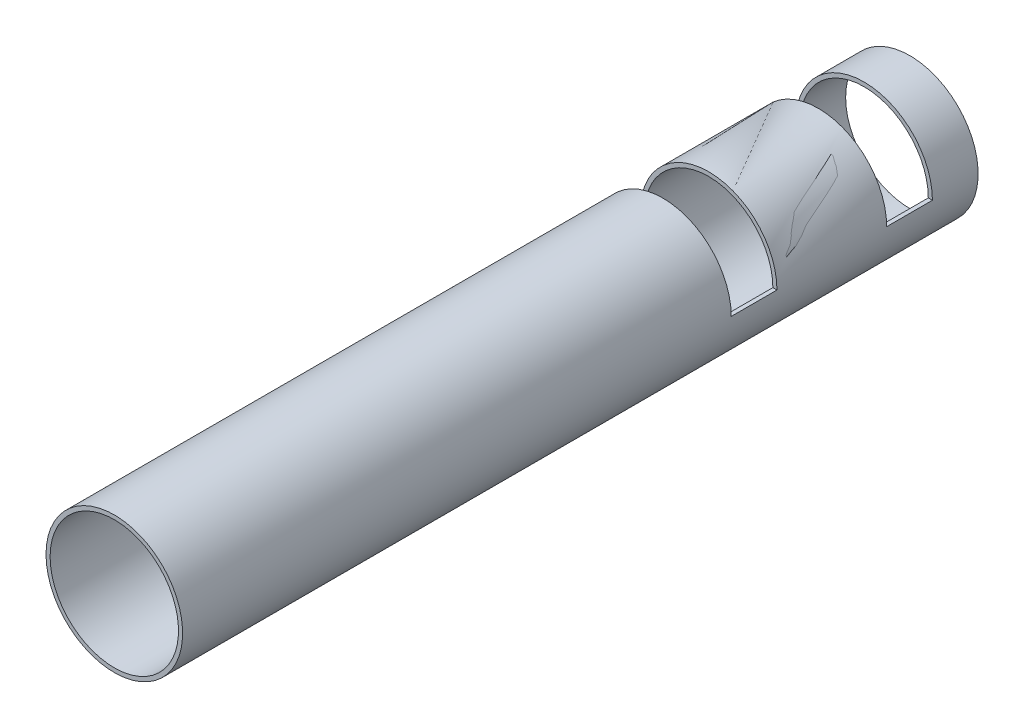
ISO-10303-21;
HEADER;
FILE_DESCRIPTION(('STEP AP214'),'2;1');
FILE_NAME('part.step','',(''),(''),'','','');
FILE_SCHEMA(('AUTOMOTIVE_DESIGN { 1 0 10303 214 1 1 1 1 }'));
ENDSEC;
DATA;
#1=APPLICATION_CONTEXT('core data for automotive mechanical design processes');
#2=APPLICATION_PROTOCOL_DEFINITION('international standard','automotive_design',2000,#1);
#3=PRODUCT_CONTEXT('',#1,'mechanical');
#4=PRODUCT('Part','Part','',(#3));
#5=PRODUCT_RELATED_PRODUCT_CATEGORY('part','',(#4));
#6=PRODUCT_DEFINITION_FORMATION('','',#4);
#7=PRODUCT_DEFINITION_CONTEXT('part definition',#1,'design');
#8=PRODUCT_DEFINITION('design','',#6,#7);
#9=PRODUCT_DEFINITION_SHAPE('','',#8);
#10=(LENGTH_UNIT() NAMED_UNIT(*) SI_UNIT(.MILLI.,.METRE.));
#11=(NAMED_UNIT(*) PLANE_ANGLE_UNIT() SI_UNIT($,.RADIAN.));
#12=(NAMED_UNIT(*) SI_UNIT($,.STERADIAN.) SOLID_ANGLE_UNIT());
#13=UNCERTAINTY_MEASURE_WITH_UNIT(LENGTH_MEASURE(1.E-05),#10,'distance_accuracy_value','');
#14=(GEOMETRIC_REPRESENTATION_CONTEXT(3) GLOBAL_UNCERTAINTY_ASSIGNED_CONTEXT((#13)) GLOBAL_UNIT_ASSIGNED_CONTEXT((#10,
#11,#12)) REPRESENTATION_CONTEXT('',''));
#15=CARTESIAN_POINT('',(0.,0.,0.));
#16=DIRECTION('',(0.,0.,1.));
#17=DIRECTION('',(1.,0.,0.));
#18=AXIS2_PLACEMENT_3D('',#15,#16,#17);
#19=CARTESIAN_POINT('',(0.,0.,27.));
#20=DIRECTION('',(0.,0.,1.));
#21=DIRECTION('',(1.,0.,0.));
#22=AXIS2_PLACEMENT_3D('',#19,#20,#21);
#23=PLANE('',#22);
#24=DIRECTION('',(1.,0.,0.));
#25=VECTOR('',#24,1.);
#26=CARTESIAN_POINT('',(0.,0.,27.));
#27=LINE('',#26,#25);
#28=CARTESIAN_POINT('',(-7.47,0.,27.));
#29=VERTEX_POINT('',#28);
#30=CARTESIAN_POINT('',(-7.02,0.,27.));
#31=VERTEX_POINT('',#30);
#32=EDGE_CURVE('E77',#29,#31,#27,.T.);
#33=ORIENTED_EDGE('',*,*,#32,.F.);
#34=CARTESIAN_POINT('',(0.,0.,27.));
#35=DIRECTION('',(0.,0.,-1.));
#36=DIRECTION('',(-1.,0.,0.));
#37=AXIS2_PLACEMENT_3D('',#34,#35,#36);
#38=CIRCLE('',#37,7.47);
#39=CARTESIAN_POINT('',(7.47,0.,27.));
#40=VERTEX_POINT('',#39);
#41=EDGE_CURVE('E100',#40,#29,#38,.F.);
#42=ORIENTED_EDGE('',*,*,#41,.F.);
#43=DIRECTION('',(1.,0.,0.));
#44=VECTOR('',#43,1.);
#45=CARTESIAN_POINT('',(0.,0.,27.));
#46=LINE('',#45,#44);
#47=CARTESIAN_POINT('',(7.02,0.,27.));
#48=VERTEX_POINT('',#47);
#49=EDGE_CURVE('E94',#48,#40,#46,.T.);
#50=ORIENTED_EDGE('',*,*,#49,.F.);
#51=CARTESIAN_POINT('',(0.,0.,27.));
#52=DIRECTION('',(0.,0.,-1.));
#53=DIRECTION('',(-1.,0.,0.));
#54=AXIS2_PLACEMENT_3D('',#51,#52,#53);
#55=CIRCLE('',#54,7.02);
#56=EDGE_CURVE('E20',#31,#48,#55,.T.);
#57=ORIENTED_EDGE('',*,*,#56,.F.);
#58=EDGE_LOOP('',(#33,#42,#50,#57));
#59=FACE_BOUND('',#58,.T.);
#60=ADVANCED_FACE('F17',(#59),#23,.F.);
#61=CARTESIAN_POINT('',(0.,0.,5.));
#62=DIRECTION('',(0.,0.,1.));
#63=DIRECTION('',(1.,0.,0.));
#64=AXIS2_PLACEMENT_3D('',#61,#62,#63);
#65=PLANE('',#64);
#66=DIRECTION('',(1.,0.,0.));
#67=VECTOR('',#66,1.);
#68=CARTESIAN_POINT('',(0.,0.,5.));
#69=LINE('',#68,#67);
#70=CARTESIAN_POINT('',(-7.47,0.,5.));
#71=VERTEX_POINT('',#70);
#72=CARTESIAN_POINT('',(-7.02,0.,5.));
#73=VERTEX_POINT('',#72);
#74=EDGE_CURVE('E142',#71,#73,#69,.T.);
#75=ORIENTED_EDGE('',*,*,#74,.T.);
#76=CARTESIAN_POINT('',(0.,0.,5.));
#77=DIRECTION('',(0.,0.,-1.));
#78=DIRECTION('',(-1.,0.,0.));
#79=AXIS2_PLACEMENT_3D('',#76,#77,#78);
#80=CIRCLE('',#79,7.02);
#81=CARTESIAN_POINT('',(7.02,0.,5.));
#82=VERTEX_POINT('',#81);
#83=EDGE_CURVE('E133',#73,#82,#80,.T.);
#84=ORIENTED_EDGE('',*,*,#83,.T.);
#85=DIRECTION('',(1.,0.,0.));
#86=VECTOR('',#85,1.);
#87=CARTESIAN_POINT('',(0.,0.,5.));
#88=LINE('',#87,#86);
#89=CARTESIAN_POINT('',(7.47,0.,5.));
#90=VERTEX_POINT('',#89);
#91=EDGE_CURVE('E90',#82,#90,#88,.T.);
#92=ORIENTED_EDGE('',*,*,#91,.T.);
#93=CARTESIAN_POINT('',(0.,0.,5.));
#94=DIRECTION('',(0.,0.,-1.));
#95=DIRECTION('',(-1.,0.,0.));
#96=AXIS2_PLACEMENT_3D('',#93,#94,#95);
#97=CIRCLE('',#96,7.47);
#98=EDGE_CURVE('E117',#71,#90,#97,.T.);
#99=ORIENTED_EDGE('',*,*,#98,.F.);
#100=EDGE_LOOP('',(#75,#84,#92,#99));
#101=FACE_BOUND('',#100,.T.);
#102=ADVANCED_FACE('F218',(#101),#65,.T.);
#103=CARTESIAN_POINT('',(0.,0.,22.));
#104=DIRECTION('',(0.,0.,1.));
#105=DIRECTION('',(1.,0.,0.));
#106=AXIS2_PLACEMENT_3D('',#103,#104,#105);
#107=PLANE('',#106);
#108=CARTESIAN_POINT('',(0.,0.,22.));
#109=DIRECTION('',(0.,0.,-1.));
#110=DIRECTION('',(-1.,0.,0.));
#111=AXIS2_PLACEMENT_3D('',#108,#109,#110);
#112=CIRCLE('',#111,7.47);
#113=CARTESIAN_POINT('',(-7.47,0.,22.));
#114=VERTEX_POINT('',#113);
#115=CARTESIAN_POINT('',(7.47,0.,22.));
#116=VERTEX_POINT('',#115);
#117=EDGE_CURVE('E114',#114,#116,#112,.T.);
#118=ORIENTED_EDGE('',*,*,#117,.F.);
#119=DIRECTION('',(1.,0.,0.));
#120=VECTOR('',#119,1.);
#121=CARTESIAN_POINT('',(0.,0.,22.));
#122=LINE('',#121,#120);
#123=CARTESIAN_POINT('',(-7.02,0.,22.));
#124=VERTEX_POINT('',#123);
#125=EDGE_CURVE('E126',#114,#124,#122,.T.);
#126=ORIENTED_EDGE('',*,*,#125,.T.);
#127=CARTESIAN_POINT('',(0.,0.,22.));
#128=DIRECTION('',(0.,0.,-1.));
#129=DIRECTION('',(-1.,0.,0.));
#130=AXIS2_PLACEMENT_3D('',#127,#128,#129);
#131=CIRCLE('',#130,7.02);
#132=CARTESIAN_POINT('',(7.02,0.,22.));
#133=VERTEX_POINT('',#132);
#134=EDGE_CURVE('E132',#124,#133,#131,.T.);
#135=ORIENTED_EDGE('',*,*,#134,.T.);
#136=DIRECTION('',(1.,0.,0.));
#137=VECTOR('',#136,1.);
#138=CARTESIAN_POINT('',(0.,0.,22.));
#139=LINE('',#138,#137);
#140=EDGE_CURVE('E35',#133,#116,#139,.T.);
#141=ORIENTED_EDGE('',*,*,#140,.T.);
#142=EDGE_LOOP('',(#118,#126,#135,#141));
#143=FACE_BOUND('',#142,.T.);
#144=ADVANCED_FACE('F214',(#143),#107,.T.);
#145=CARTESIAN_POINT('',(0.,0.,10.));
#146=DIRECTION('',(0.,0.,1.));
#147=DIRECTION('',(1.,0.,0.));
#148=AXIS2_PLACEMENT_3D('',#145,#146,#147);
#149=PLANE('',#148);
#150=DIRECTION('',(1.,0.,0.));
#151=VECTOR('',#150,1.);
#152=CARTESIAN_POINT('',(0.,0.,9.99999999999999));
#153=LINE('',#152,#151);
#154=CARTESIAN_POINT('',(-7.02,0.,9.99999999999999));
#155=VERTEX_POINT('',#154);
#156=CARTESIAN_POINT('',(-7.47,0.,9.99999999999999));
#157=VERTEX_POINT('',#156);
#158=EDGE_CURVE('E124',#155,#157,#153,.F.);
#159=ORIENTED_EDGE('',*,*,#158,.T.);
#160=CARTESIAN_POINT('',(0.,0.,9.99999999999999));
#161=DIRECTION('',(0.,0.,-1.));
#162=DIRECTION('',(-1.,0.,0.));
#163=AXIS2_PLACEMENT_3D('',#160,#161,#162);
#164=CIRCLE('',#163,7.47);
#165=CARTESIAN_POINT('',(7.47,0.,9.99999999999999));
#166=VERTEX_POINT('',#165);
#167=EDGE_CURVE('E97',#166,#157,#164,.F.);
#168=ORIENTED_EDGE('',*,*,#167,.F.);
#169=DIRECTION('',(1.,0.,0.));
#170=VECTOR('',#169,1.);
#171=CARTESIAN_POINT('',(0.,0.,9.99999999999999));
#172=LINE('',#171,#170);
#173=CARTESIAN_POINT('',(7.02,0.,9.99999999999999));
#174=VERTEX_POINT('',#173);
#175=EDGE_CURVE('E116',#166,#174,#172,.F.);
#176=ORIENTED_EDGE('',*,*,#175,.T.);
#177=CARTESIAN_POINT('',(0.,0.,9.99999999999999));
#178=DIRECTION('',(0.,0.,-1.));
#179=DIRECTION('',(-1.,0.,0.));
#180=AXIS2_PLACEMENT_3D('',#177,#178,#179);
#181=CIRCLE('',#180,7.02);
#182=EDGE_CURVE('E130',#155,#174,#181,.T.);
#183=ORIENTED_EDGE('',*,*,#182,.F.);
#184=EDGE_LOOP('',(#159,#168,#176,#183));
#185=FACE_BOUND('',#184,.T.);
#186=ADVANCED_FACE('F167',(#185),#149,.F.);
#187=CARTESIAN_POINT('',(0.,0.,87.));
#188=DIRECTION('',(0.,0.,-1.));
#189=DIRECTION('',(-1.,0.,0.));
#190=AXIS2_PLACEMENT_3D('',#187,#188,#189);
#191=CYLINDRICAL_SURFACE('',#190,7.02);
#192=DIRECTION('',(0.,0.,-1.));
#193=VECTOR('',#192,1.);
#194=CARTESIAN_POINT('',(-7.02,0.,87.));
#195=LINE('',#194,#193);
#196=EDGE_CURVE('E87',#124,#31,#195,.F.);
#197=ORIENTED_EDGE('',*,*,#196,.T.);
#198=ORIENTED_EDGE('',*,*,#56,.T.);
#199=DIRECTION('',(0.,0.,-1.));
#200=VECTOR('',#199,1.);
#201=CARTESIAN_POINT('',(7.02,0.,87.));
#202=LINE('',#201,#200);
#203=EDGE_CURVE('E86',#48,#133,#202,.T.);
#204=ORIENTED_EDGE('',*,*,#203,.T.);
#205=ORIENTED_EDGE('',*,*,#134,.F.);
#206=EDGE_LOOP('',(#197,#198,#204,#205));
#207=FACE_BOUND('',#206,.T.);
#208=DIRECTION('',(0.,0.,-1.));
#209=VECTOR('',#208,1.);
#210=CARTESIAN_POINT('',(-7.02,0.,87.));
#211=LINE('',#210,#209);
#212=EDGE_CURVE('E141',#73,#155,#211,.F.);
#213=ORIENTED_EDGE('',*,*,#212,.T.);
#214=ORIENTED_EDGE('',*,*,#182,.T.);
#215=DIRECTION('',(0.,0.,-1.));
#216=VECTOR('',#215,1.);
#217=CARTESIAN_POINT('',(7.02,0.,87.));
#218=LINE('',#217,#216);
#219=EDGE_CURVE('E120',#174,#82,#218,.T.);
#220=ORIENTED_EDGE('',*,*,#219,.T.);
#221=ORIENTED_EDGE('',*,*,#83,.F.);
#222=EDGE_LOOP('',(#213,#214,#220,#221));
#223=FACE_BOUND('',#222,.T.);
#224=CARTESIAN_POINT('',(0.,0.,0.));
#225=DIRECTION('',(0.,0.,-1.));
#226=DIRECTION('',(-1.,0.,0.));
#227=AXIS2_PLACEMENT_3D('',#224,#225,#226);
#228=CIRCLE('',#227,7.02);
#229=CARTESIAN_POINT('',(-7.02,0.,0.));
#230=VERTEX_POINT('',#229);
#231=EDGE_CURVE('E121',#230,#230,#228,.T.);
#232=ORIENTED_EDGE('',*,*,#231,.T.);
#233=EDGE_LOOP('',(#232));
#234=FACE_BOUND('',#233,.T.);
#235=CARTESIAN_POINT('',(0.,0.,87.));
#236=DIRECTION('',(0.,0.,-1.));
#237=DIRECTION('',(-1.,0.,0.));
#238=AXIS2_PLACEMENT_3D('',#235,#236,#237);
#239=CIRCLE('',#238,7.02);
#240=CARTESIAN_POINT('',(-7.02,0.,87.));
#241=VERTEX_POINT('',#240);
#242=EDGE_CURVE('E127',#241,#241,#239,.T.);
#243=ORIENTED_EDGE('',*,*,#242,.F.);
#244=EDGE_LOOP('',(#243));
#245=FACE_BOUND('',#244,.T.);
#246=ADVANCED_FACE('F84',(#207,#223,#234,#245),#191,.F.);
#247=CARTESIAN_POINT('',(0.,0.,87.));
#248=DIRECTION('',(0.,0.,1.));
#249=DIRECTION('',(1.,0.,0.));
#250=AXIS2_PLACEMENT_3D('',#247,#248,#249);
#251=PLANE('',#250);
#252=CARTESIAN_POINT('',(0.,0.,87.));
#253=DIRECTION('',(0.,0.,-1.));
#254=DIRECTION('',(-1.,0.,0.));
#255=AXIS2_PLACEMENT_3D('',#252,#253,#254);
#256=CIRCLE('',#255,7.47);
#257=CARTESIAN_POINT('',(-7.47,0.,87.));
#258=VERTEX_POINT('',#257);
#259=EDGE_CURVE('E96',#258,#258,#256,.T.);
#260=ORIENTED_EDGE('',*,*,#259,.F.);
#261=EDGE_LOOP('',(#260));
#262=FACE_BOUND('',#261,.T.);
#263=ORIENTED_EDGE('',*,*,#242,.T.);
#264=EDGE_LOOP('',(#263));
#265=FACE_BOUND('',#264,.T.);
#266=ADVANCED_FACE('F177',(#262,#265),#251,.T.);
#267=CARTESIAN_POINT('',(0.,0.,87.));
#268=DIRECTION('',(0.,-1.,0.));
#269=DIRECTION('',(0.,0.,-1.));
#270=AXIS2_PLACEMENT_3D('',#267,#268,#269);
#271=PLANE('',#270);
#272=ORIENTED_EDGE('',*,*,#196,.F.);
#273=ORIENTED_EDGE('',*,*,#125,.F.);
#274=DIRECTION('',(0.,0.,-1.));
#275=VECTOR('',#274,1.);
#276=CARTESIAN_POINT('',(-7.47,0.,87.));
#277=LINE('',#276,#275);
#278=EDGE_CURVE('E111',#29,#114,#277,.T.);
#279=ORIENTED_EDGE('',*,*,#278,.F.);
#280=ORIENTED_EDGE('',*,*,#32,.T.);
#281=EDGE_LOOP('',(#272,#273,#279,#280));
#282=FACE_BOUND('',#281,.T.);
#283=ADVANCED_FACE('F174',(#282),#271,.F.);
#284=CARTESIAN_POINT('',(0.,0.,87.));
#285=DIRECTION('',(0.,-1.,0.));
#286=DIRECTION('',(0.,0.,-1.));
#287=AXIS2_PLACEMENT_3D('',#284,#285,#286);
#288=PLANE('',#287);
#289=ORIENTED_EDGE('',*,*,#212,.F.);
#290=ORIENTED_EDGE('',*,*,#74,.F.);
#291=DIRECTION('',(0.,0.,-1.));
#292=VECTOR('',#291,1.);
#293=CARTESIAN_POINT('',(-7.47,0.,87.));
#294=LINE('',#293,#292);
#295=EDGE_CURVE('E108',#157,#71,#294,.T.);
#296=ORIENTED_EDGE('',*,*,#295,.F.);
#297=ORIENTED_EDGE('',*,*,#158,.F.);
#298=EDGE_LOOP('',(#289,#290,#296,#297));
#299=FACE_BOUND('',#298,.T.);
#300=ADVANCED_FACE('F176',(#299),#288,.F.);
#301=CARTESIAN_POINT('',(0.,0.,0.));
#302=DIRECTION('',(0.,0.,1.));
#303=DIRECTION('',(1.,0.,0.));
#304=AXIS2_PLACEMENT_3D('',#301,#302,#303);
#305=PLANE('',#304);
#306=CARTESIAN_POINT('',(0.,0.,0.));
#307=DIRECTION('',(0.,0.,-1.));
#308=DIRECTION('',(-1.,0.,0.));
#309=AXIS2_PLACEMENT_3D('',#306,#307,#308);
#310=CIRCLE('',#309,7.47);
#311=CARTESIAN_POINT('',(-7.47,0.,0.));
#312=VERTEX_POINT('',#311);
#313=EDGE_CURVE('E105',#312,#312,#310,.F.);
#314=ORIENTED_EDGE('',*,*,#313,.F.);
#315=EDGE_LOOP('',(#314));
#316=FACE_BOUND('',#315,.T.);
#317=ORIENTED_EDGE('',*,*,#231,.F.);
#318=EDGE_LOOP('',(#317));
#319=FACE_BOUND('',#318,.T.);
#320=ADVANCED_FACE('F184',(#316,#319),#305,.F.);
#321=CARTESIAN_POINT('',(0.,0.,87.));
#322=DIRECTION('',(0.,-1.,0.));
#323=DIRECTION('',(0.,0.,-1.));
#324=AXIS2_PLACEMENT_3D('',#321,#322,#323);
#325=PLANE('',#324);
#326=DIRECTION('',(0.,0.,-1.));
#327=VECTOR('',#326,1.);
#328=CARTESIAN_POINT('',(7.47,0.,87.));
#329=LINE('',#328,#327);
#330=EDGE_CURVE('E26',#90,#166,#329,.F.);
#331=ORIENTED_EDGE('',*,*,#330,.F.);
#332=ORIENTED_EDGE('',*,*,#91,.F.);
#333=ORIENTED_EDGE('',*,*,#219,.F.);
#334=ORIENTED_EDGE('',*,*,#175,.F.);
#335=EDGE_LOOP('',(#331,#332,#333,#334));
#336=FACE_BOUND('',#335,.T.);
#337=ADVANCED_FACE('F161',(#336),#325,.F.);
#338=CARTESIAN_POINT('',(0.,0.,87.));
#339=DIRECTION('',(0.,-1.,0.));
#340=DIRECTION('',(0.,0.,-1.));
#341=AXIS2_PLACEMENT_3D('',#338,#339,#340);
#342=PLANE('',#341);
#343=DIRECTION('',(0.,0.,-1.));
#344=VECTOR('',#343,1.);
#345=CARTESIAN_POINT('',(7.47,0.,87.));
#346=LINE('',#345,#344);
#347=EDGE_CURVE('E11',#116,#40,#346,.F.);
#348=ORIENTED_EDGE('',*,*,#347,.F.);
#349=ORIENTED_EDGE('',*,*,#140,.F.);
#350=ORIENTED_EDGE('',*,*,#203,.F.);
#351=ORIENTED_EDGE('',*,*,#49,.T.);
#352=EDGE_LOOP('',(#348,#349,#350,#351));
#353=FACE_BOUND('',#352,.T.);
#354=ADVANCED_FACE('F93',(#353),#342,.F.);
#355=CARTESIAN_POINT('',(0.,0.,87.));
#356=DIRECTION('',(0.,0.,-1.));
#357=DIRECTION('',(-1.,0.,0.));
#358=AXIS2_PLACEMENT_3D('',#355,#356,#357);
#359=CYLINDRICAL_SURFACE('',#358,7.47);
#360=ORIENTED_EDGE('',*,*,#259,.T.);
#361=EDGE_LOOP('',(#360));
#362=FACE_BOUND('',#361,.T.);
#363=ORIENTED_EDGE('',*,*,#167,.T.);
#364=ORIENTED_EDGE('',*,*,#295,.T.);
#365=ORIENTED_EDGE('',*,*,#98,.T.);
#366=ORIENTED_EDGE('',*,*,#330,.T.);
#367=EDGE_LOOP('',(#363,#364,#365,#366));
#368=FACE_BOUND('',#367,.T.);
#369=ORIENTED_EDGE('',*,*,#313,.T.);
#370=EDGE_LOOP('',(#369));
#371=FACE_BOUND('',#370,.T.);
#372=ORIENTED_EDGE('',*,*,#278,.T.);
#373=ORIENTED_EDGE('',*,*,#117,.T.);
#374=ORIENTED_EDGE('',*,*,#347,.T.);
#375=ORIENTED_EDGE('',*,*,#41,.T.);
#376=EDGE_LOOP('',(#372,#373,#374,#375));
#377=FACE_BOUND('',#376,.T.);
#378=ADVANCED_FACE('F155',(#362,#368,#371,#377),#359,.T.);
#379=CLOSED_SHELL('',(#60,#102,#144,#186,#246,#266,#283,#300,#320,#337,#354,#378));
#380=MANIFOLD_SOLID_BREP('B1',#379);
#381=ADVANCED_BREP_SHAPE_REPRESENTATION('',(#18,#380),#14);
#382=SHAPE_DEFINITION_REPRESENTATION(#9,#381);
ENDSEC;
END-ISO-10303-21;
